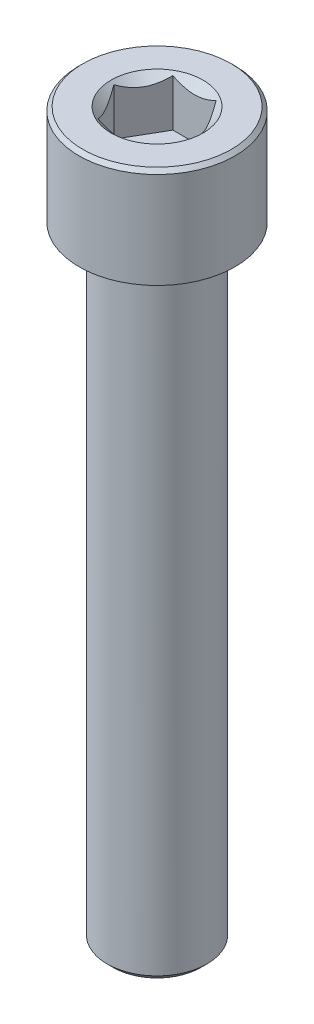
ISO-10303-21;
HEADER;
FILE_DESCRIPTION(('STEP AP214'),'2;1');
FILE_NAME('part.step','',(''),(''),'','','');
FILE_SCHEMA(('AUTOMOTIVE_DESIGN { 1 0 10303 214 1 1 1 1 }'));
ENDSEC;
DATA;
#1=APPLICATION_CONTEXT('core data for automotive mechanical design processes');
#2=APPLICATION_PROTOCOL_DEFINITION('international standard','automotive_design',2000,#1);
#3=PRODUCT_CONTEXT('',#1,'mechanical');
#4=PRODUCT('Part','Part','',(#3));
#5=PRODUCT_RELATED_PRODUCT_CATEGORY('part','',(#4));
#6=PRODUCT_DEFINITION_FORMATION('','',#4);
#7=PRODUCT_DEFINITION_CONTEXT('part definition',#1,'design');
#8=PRODUCT_DEFINITION('design','',#6,#7);
#9=PRODUCT_DEFINITION_SHAPE('','',#8);
#10=(LENGTH_UNIT() NAMED_UNIT(*) SI_UNIT(.MILLI.,.METRE.));
#11=(NAMED_UNIT(*) PLANE_ANGLE_UNIT() SI_UNIT($,.RADIAN.));
#12=(NAMED_UNIT(*) SI_UNIT($,.STERADIAN.) SOLID_ANGLE_UNIT());
#13=UNCERTAINTY_MEASURE_WITH_UNIT(LENGTH_MEASURE(1.E-05),#10,'distance_accuracy_value','');
#14=(GEOMETRIC_REPRESENTATION_CONTEXT(3) GLOBAL_UNCERTAINTY_ASSIGNED_CONTEXT((#13)) GLOBAL_UNIT_ASSIGNED_CONTEXT((#10,
#11,#12)) REPRESENTATION_CONTEXT('',''));
#15=CARTESIAN_POINT('',(0.,0.,0.));
#16=DIRECTION('',(0.,0.,1.));
#17=DIRECTION('',(1.,0.,0.));
#18=AXIS2_PLACEMENT_3D('',#15,#16,#17);
#19=CARTESIAN_POINT('',(0.,0.,0.));
#20=DIRECTION('',(0.,1.,0.));
#21=DIRECTION('',(0.,0.,1.));
#22=AXIS2_PLACEMENT_3D('',#19,#20,#21);
#23=PLANE('',#22);
#24=CARTESIAN_POINT('',(0.,0.,0.));
#25=DIRECTION('',(0.,1.,0.));
#26=DIRECTION('',(0.,0.,1.));
#27=AXIS2_PLACEMENT_3D('',#24,#25,#26);
#28=CIRCLE('',#27,3.5);
#29=CARTESIAN_POINT('',(0.,0.,3.5));
#30=VERTEX_POINT('',#29);
#31=EDGE_CURVE('E43',#30,#30,#28,.F.);
#32=ORIENTED_EDGE('',*,*,#31,.T.);
#33=EDGE_LOOP('',(#32));
#34=FACE_BOUND('',#33,.T.);
#35=ADVANCED_FACE('F35',(#34),#23,.F.);
#36=CARTESIAN_POINT('',(0.,0.,0.));
#37=DIRECTION('',(0.,-1.,0.));
#38=DIRECTION('',(0.,0.,-1.));
#39=AXIS2_PLACEMENT_3D('',#36,#37,#38);
#40=CYLINDRICAL_SURFACE('',#39,4.);
#41=CARTESIAN_POINT('',(0.,0.500000000000004,0.));
#42=DIRECTION('',(0.,1.,0.));
#43=DIRECTION('',(0.,0.,1.));
#44=AXIS2_PLACEMENT_3D('',#41,#42,#43);
#45=CIRCLE('',#44,4.);
#46=CARTESIAN_POINT('',(0.,0.500000000000004,4.));
#47=VERTEX_POINT('',#46);
#48=EDGE_CURVE('E11',#47,#47,#45,.T.);
#49=ORIENTED_EDGE('',*,*,#48,.T.);
#50=EDGE_LOOP('',(#49));
#51=FACE_BOUND('',#50,.T.);
#52=CARTESIAN_POINT('',(0.,50.,0.));
#53=DIRECTION('',(0.,-1.,0.));
#54=DIRECTION('',(0.,0.,-1.));
#55=AXIS2_PLACEMENT_3D('',#52,#53,#54);
#56=CIRCLE('',#55,4.);
#57=CARTESIAN_POINT('',(0.,50.,-4.));
#58=VERTEX_POINT('',#57);
#59=EDGE_CURVE('E120',#58,#58,#56,.T.);
#60=ORIENTED_EDGE('',*,*,#59,.T.);
#61=EDGE_LOOP('',(#60));
#62=FACE_BOUND('',#61,.T.);
#63=ADVANCED_FACE('F191',(#51,#62),#40,.T.);
#64=CARTESIAN_POINT('',(-4.,50.,0.));
#65=DIRECTION('',(0.,1.,0.));
#66=DIRECTION('',(0.,0.,1.));
#67=AXIS2_PLACEMENT_3D('',#64,#65,#66);
#68=PLANE('',#67);
#69=ORIENTED_EDGE('',*,*,#59,.F.);
#70=EDGE_LOOP('',(#69));
#71=FACE_BOUND('',#70,.T.);
#72=CARTESIAN_POINT('',(0.,50.,0.));
#73=DIRECTION('',(0.,-1.,0.));
#74=DIRECTION('',(0.,0.,-1.));
#75=AXIS2_PLACEMENT_3D('',#72,#73,#74);
#76=CIRCLE('',#75,6.25);
#77=CARTESIAN_POINT('',(0.,50.,-6.25));
#78=VERTEX_POINT('',#77);
#79=EDGE_CURVE('E117',#78,#78,#76,.T.);
#80=ORIENTED_EDGE('',*,*,#79,.T.);
#81=EDGE_LOOP('',(#80));
#82=FACE_BOUND('',#81,.T.);
#83=ADVANCED_FACE('F197',(#71,#82),#68,.F.);
#84=CARTESIAN_POINT('',(0.,0.,0.));
#85=DIRECTION('',(0.,-1.,0.));
#86=DIRECTION('',(0.,0.,-1.));
#87=AXIS2_PLACEMENT_3D('',#84,#85,#86);
#88=CYLINDRICAL_SURFACE('',#87,6.25);
#89=CARTESIAN_POINT('',(0.,57.7,0.));
#90=DIRECTION('',(0.,-1.,0.));
#91=DIRECTION('',(0.,0.,-1.));
#92=AXIS2_PLACEMENT_3D('',#89,#90,#91);
#93=CIRCLE('',#92,6.25);
#94=CARTESIAN_POINT('',(0.,57.7,-6.25));
#95=VERTEX_POINT('',#94);
#96=EDGE_CURVE('E123',#95,#95,#93,.T.);
#97=ORIENTED_EDGE('',*,*,#96,.T.);
#98=EDGE_LOOP('',(#97));
#99=FACE_BOUND('',#98,.T.);
#100=ORIENTED_EDGE('',*,*,#79,.F.);
#101=EDGE_LOOP('',(#100));
#102=FACE_BOUND('',#101,.T.);
#103=ADVANCED_FACE('F208',(#99,#102),#88,.T.);
#104=CARTESIAN_POINT('',(-6.25,58.,0.));
#105=DIRECTION('',(0.,-1.,0.));
#106=DIRECTION('',(0.,0.,-1.));
#107=AXIS2_PLACEMENT_3D('',#104,#105,#106);
#108=PLANE('',#107);
#109=CARTESIAN_POINT('',(0.,58.,0.));
#110=DIRECTION('',(0.,1.,0.));
#111=DIRECTION('',(0.,0.,1.));
#112=AXIS2_PLACEMENT_3D('',#109,#110,#111);
#113=CIRCLE('',#112,3.68172134015619);
#114=CARTESIAN_POINT('',(0.,58.,3.68172134015619));
#115=VERTEX_POINT('',#114);
#116=EDGE_CURVE('E338',#115,#115,#113,.T.);
#117=ORIENTED_EDGE('',*,*,#116,.F.);
#118=EDGE_LOOP('',(#117));
#119=FACE_BOUND('',#118,.T.);
#120=CARTESIAN_POINT('',(0.,58.,0.));
#121=DIRECTION('',(0.,-1.,0.));
#122=DIRECTION('',(0.,0.,-1.));
#123=AXIS2_PLACEMENT_3D('',#120,#121,#122);
#124=CIRCLE('',#123,5.94999999999999);
#125=CARTESIAN_POINT('',(0.,58.,-5.94999999999999));
#126=VERTEX_POINT('',#125);
#127=EDGE_CURVE('E94',#126,#126,#124,.F.);
#128=ORIENTED_EDGE('',*,*,#127,.T.);
#129=EDGE_LOOP('',(#128));
#130=FACE_BOUND('',#129,.T.);
#131=ADVANCED_FACE('F203',(#119,#130),#108,.F.);
#132=CARTESIAN_POINT('',(0.,57.7,0.));
#133=DIRECTION('',(0.,-1.,0.));
#134=DIRECTION('',(0.,0.,-1.));
#135=AXIS2_PLACEMENT_3D('',#132,#133,#134);
#136=CONICAL_SURFACE('',#135,6.25,0.78539816339744);
#137=ORIENTED_EDGE('',*,*,#127,.F.);
#138=EDGE_LOOP('',(#137));
#139=FACE_BOUND('',#138,.T.);
#140=ORIENTED_EDGE('',*,*,#96,.F.);
#141=EDGE_LOOP('',(#140));
#142=FACE_BOUND('',#141,.T.);
#143=ADVANCED_FACE('F139',(#139,#142),#136,.T.);
#144=CARTESIAN_POINT('',(0.,58.,0.));
#145=DIRECTION('',(0.,1.,0.));
#146=DIRECTION('',(0.,0.,1.));
#147=AXIS2_PLACEMENT_3D('',#144,#145,#146);
#148=CONICAL_SURFACE('',#147,3.68172134015619,0.785398163397449);
#149=ORIENTED_EDGE('',*,*,#116,.T.);
#150=EDGE_LOOP('',(#149));
#151=FACE_BOUND('',#150,.T.);
#152=CARTESIAN_POINT('',(-3.57414153717217,58.9845928078347,3.));
#153=CARTESIAN_POINT('',(-3.48763354421076,58.918347344031,3.));
#154=CARTESIAN_POINT('',(-3.40065485701271,58.8527068014046,3.));
#155=CARTESIAN_POINT('',(-3.22556536628367,58.7229105596247,3.));
#156=CARTESIAN_POINT('',(-3.13745429592207,58.6587552207989,3.));
#157=CARTESIAN_POINT('',(-2.95926502940819,58.5317477625692,3.));
#158=CARTESIAN_POINT('',(-2.86917689491203,58.4689095404859,3.));
#159=CARTESIAN_POINT('',(-2.68749351951163,58.3454583721269,3.));
#160=CARTESIAN_POINT('',(-2.5958983836401,58.2848452717117,3.));
#161=CARTESIAN_POINT('',(-2.40523426187287,58.1626856152111,3.));
#162=CARTESIAN_POINT('',(-2.30605328102178,58.1013129786067,3.));
#163=CARTESIAN_POINT('',(-2.10536506104801,57.9824325210317,3.));
#164=CARTESIAN_POINT('',(-2.00385743987678,57.9249253409785,3.));
#165=CARTESIAN_POINT('',(-1.79849745550954,57.8150046063731,3.));
#166=CARTESIAN_POINT('',(-1.69465316441121,57.7625760890662,3.));
#167=CARTESIAN_POINT('',(-1.48405420683511,57.663987161909,3.));
#168=CARTESIAN_POINT('',(-1.37730092797841,57.6178238242346,3.));
#169=CARTESIAN_POINT('',(-1.17088222190216,57.5374103113695,3.));
#170=CARTESIAN_POINT('',(-1.07149734601239,57.5024473221765,3.));
#171=CARTESIAN_POINT('',(-0.870230144552075,57.4404802404136,3.));
#172=CARTESIAN_POINT('',(-0.768347657354245,57.4134766643998,3.));
#173=CARTESIAN_POINT('',(-0.56444762477906,57.3693266023403,3.));
#174=CARTESIAN_POINT('',(-0.462468933304163,57.3520036676269,3.));
#175=CARTESIAN_POINT('',(-0.257288650084503,57.3275703633682,3.));
#176=CARTESIAN_POINT('',(-0.154087304614488,57.3204579712627,3.));
#177=CARTESIAN_POINT('',(0.0481861337271408,57.3170323431805,3.));
#178=CARTESIAN_POINT('',(0.147250905244534,57.3202810238262,3.));
#179=CARTESIAN_POINT('',(0.344589076655321,57.3364014246806,3.));
#180=CARTESIAN_POINT('',(0.442862402476964,57.3492740352571,3.));
#181=CARTESIAN_POINT('',(0.639570667541512,57.3841396910622,3.));
#182=CARTESIAN_POINT('',(0.737976852204936,57.4062922789742,3.));
#183=CARTESIAN_POINT('',(0.932628435913932,57.4585009084323,3.));
#184=CARTESIAN_POINT('',(1.02887397223985,57.4885564463,3.));
#185=CARTESIAN_POINT('',(1.22532003458176,57.5574747225556,3.));
#186=CARTESIAN_POINT('',(1.32536043310458,57.5967888675383,3.));
#187=CARTESIAN_POINT('',(1.5228495241282,57.6814775662887,3.));
#188=CARTESIAN_POINT('',(1.62029736425404,57.7268540844093,3.));
#189=CARTESIAN_POINT('',(1.8130860429893,57.8225985437204,3.));
#190=CARTESIAN_POINT('',(1.90841896877327,57.8729822890255,3.));
#191=CARTESIAN_POINT('',(2.09689622819786,57.9776272778976,3.));
#192=CARTESIAN_POINT('',(2.19004094502824,58.031887835746,3.));
#193=CARTESIAN_POINT('',(2.36987261179099,58.1407691556288,3.));
#194=CARTESIAN_POINT('',(2.45665114613525,58.1952394529636,3.));
#195=CARTESIAN_POINT('',(2.62871750489487,58.3064926464856,3.));
#196=CARTESIAN_POINT('',(2.71400521657293,58.3632757164947,3.));
#197=CARTESIAN_POINT('',(2.88259790064295,58.4782780272199,3.));
#198=CARTESIAN_POINT('',(2.96591330750258,58.5364820260229,3.));
#199=CARTESIAN_POINT('',(3.13140205426231,58.6544457904063,3.));
#200=CARTESIAN_POINT('',(3.21357570254096,58.7142051228644,3.));
#201=CARTESIAN_POINT('',(3.29527058173678,58.7746009335197,3.));
#202=B_SPLINE_CURVE_WITH_KNOTS('',3,(#152,#153,#154,#155,#156,#157,#158,#159,#160,#161,#162,
#163,#164,#165,#166,#167,#168,#169,#170,#171,#172,#173,#174,#175,#176,#177,#178,#179,#180,#181,
#182,#183,#184,#185,#186,#187,#188,#189,#190,#191,#192,#193,#194,#195,#196,#197,#198,#199,#200,
#201),.UNSPECIFIED.,.F.,.F.,(4,2,2,2,2,2,2,2,2,2,2,2,2,2,2,2,2,2,2,2,2,2,2,2,4),(0.,
0.32688353469634,0.653845561216812,0.983333574679493,1.31279872045119,1.66263039077581,
2.01251992306798,2.36134508374107,2.71000666706381,3.02579926641578,3.34161235580211,
3.65146388205707,3.96125402275306,4.25812208285704,4.55501761141499,4.85724167639795,
5.15944648441815,5.48166266665301,5.80398350895795,6.12735610013866,6.45067163510514,
6.75800096012909,7.06535342598929,7.37023156667126,7.67502569596997),.UNSPECIFIED.);
#203=CARTESIAN_POINT('',(-1.73205080756888,57.7823802749816,3.));
#204=VERTEX_POINT('',#203);
#205=CARTESIAN_POINT('',(1.73205080756888,57.7823802749816,3.));
#206=VERTEX_POINT('',#205);
#207=EDGE_CURVE('E101',#204,#206,#202,.T.);
#208=ORIENTED_EDGE('',*,*,#207,.F.);
#209=CARTESIAN_POINT('',(-3.46421708519159,57.7824957508087,-0.000199999999999535));
#210=CARTESIAN_POINT('',(-3.40467869607211,57.7230085933033,0.102923514955747));
#211=CARTESIAN_POINT('',(-3.3441447475778,57.6670152544471,0.207771389330649));
#212=CARTESIAN_POINT('',(-3.2207094063533,57.5644928713605,0.421567671781095));
#213=CARTESIAN_POINT('',(-3.15779627521275,57.5180208687229,0.53053641137976));
#214=CARTESIAN_POINT('',(-3.03093496880241,57.4384134634979,0.75026663959703));
#215=CARTESIAN_POINT('',(-2.96701910000606,57.4050779756242,0.860972171762213));
#216=CARTESIAN_POINT('',(-2.83778025907546,57.3537178189609,1.08482041056533));
#217=CARTESIAN_POINT('',(-2.77246123486019,57.3356548125172,1.197956279207));
#218=CARTESIAN_POINT('',(-2.65988677911464,57.3193571834321,1.3929409561927));
#219=CARTESIAN_POINT('',(-2.6127767304643,57.3169446421554,1.47453795400214));
#220=CARTESIAN_POINT('',(-2.51863325954798,57.3210097096387,1.63759922883009));
#221=CARTESIAN_POINT('',(-2.47159986993094,57.3274904350099,1.71906344929899));
#222=CARTESIAN_POINT('',(-2.37797867687426,57.3489719974968,1.88122011233837));
#223=CARTESIAN_POINT('',(-2.33139143122689,57.3639823649488,1.9619115887843));
#224=CARTESIAN_POINT('',(-2.23901705721438,57.4017039210476,2.12190869789134));
#225=CARTESIAN_POINT('',(-2.19322986779049,57.4244145193044,2.2012144363093));
#226=CARTESIAN_POINT('',(-2.11194373930153,57.4711409598355,2.34200614080275));
#227=CARTESIAN_POINT('',(-2.07626488907772,57.4939286026624,2.40380372214602));
#228=CARTESIAN_POINT('',(-2.00554773988155,57.543176561039,2.52628941752022));
#229=CARTESIAN_POINT('',(-1.97050946049034,57.5696369886478,2.5869774976356));
#230=CARTESIAN_POINT('',(-1.90118383838356,57.6256372693729,2.70705299739086));
#231=CARTESIAN_POINT('',(-1.86689452386373,57.6551674394599,2.76644383229592));
#232=CARTESIAN_POINT('',(-1.79895094584795,57.7169193665571,2.88412556146727));
#233=CARTESIAN_POINT('',(-1.76529630793217,57.7491394716409,2.94241710424773));
#234=CARTESIAN_POINT('',(-1.73193533751504,57.7824957508087,3.0002));
#235=B_SPLINE_CURVE_WITH_KNOTS('',3,(#209,#210,#211,#212,#213,#214,#215,#216,#217,#218,#219,
#220,#221,#222,#223,#224,#225,#226,#227,#228,#229,#230,#231,#232,#233,#234),.UNSPECIFIED.,.F.,
.F.,(4,2,2,2,2,2,2,2,2,2,2,2,4),(0.,0.399603557139304,0.801535286397844,1.19708369162343,
1.59163620080173,1.87398941755844,2.15644160919093,2.43921001247425,2.72195674032138,
2.94657516661926,3.17120044767274,3.3951375283781,3.61893808380739),.UNSPECIFIED.);
#236=CARTESIAN_POINT('',(-3.46410161513776,57.7823802749816,0.));
#237=VERTEX_POINT('',#236);
#238=EDGE_CURVE('E159',#237,#204,#235,.T.);
#239=ORIENTED_EDGE('',*,*,#238,.F.);
#240=CARTESIAN_POINT('',(-1.73193533751504,57.7824957508087,-3.0002));
#241=CARTESIAN_POINT('',(-1.79147372663452,57.7230085933033,-2.89707648504425));
#242=CARTESIAN_POINT('',(-1.85200767512883,57.6670152544471,-2.79222861066935));
#243=CARTESIAN_POINT('',(-1.97544301635334,57.5644928713605,-2.57843232821891));
#244=CARTESIAN_POINT('',(-2.03835614749388,57.5180208687229,-2.46946358862024));
#245=CARTESIAN_POINT('',(-2.16521745390422,57.4384134634979,-2.24973336040297));
#246=CARTESIAN_POINT('',(-2.22913332270057,57.4050779756242,-2.13902782823779));
#247=CARTESIAN_POINT('',(-2.35837216363117,57.3537178189609,-1.91517958943468));
#248=CARTESIAN_POINT('',(-2.42369118784643,57.3356548125172,-1.80204372079301));
#249=CARTESIAN_POINT('',(-2.53626564359198,57.3193571834321,-1.60705904380731));
#250=CARTESIAN_POINT('',(-2.58337569224232,57.3169446421554,-1.52546204599788));
#251=CARTESIAN_POINT('',(-2.67751916315865,57.3210097096387,-1.36240077116992));
#252=CARTESIAN_POINT('',(-2.72455255277569,57.3274904350099,-1.28093655070102));
#253=CARTESIAN_POINT('',(-2.81817374583237,57.3489719974968,-1.11877988766164));
#254=CARTESIAN_POINT('',(-2.86476099147973,57.3639823649488,-1.03808841121571));
#255=CARTESIAN_POINT('',(-2.95713536549224,57.4017039210476,-0.878091302108676));
#256=CARTESIAN_POINT('',(-3.00292255491613,57.4244145193044,-0.798785563690715));
#257=CARTESIAN_POINT('',(-3.0842086834051,57.4711409598355,-0.657993859197257));
#258=CARTESIAN_POINT('',(-3.11988753362891,57.4939286026624,-0.596196277853983));
#259=CARTESIAN_POINT('',(-3.19060468282508,57.543176561039,-0.473710582479787));
#260=CARTESIAN_POINT('',(-3.22564296221629,57.5696369886478,-0.413022502364403));
#261=CARTESIAN_POINT('',(-3.29496858432307,57.6256372693729,-0.292947002609142));
#262=CARTESIAN_POINT('',(-3.3292578988429,57.6551674394599,-0.233556167704086));
#263=CARTESIAN_POINT('',(-3.39720147685868,57.7169193665571,-0.115874438532734));
#264=CARTESIAN_POINT('',(-3.43085611477447,57.7491394716409,-0.0575828957522682));
#265=CARTESIAN_POINT('',(-3.46421708519159,57.7824957508087,0.000199999999998118));
#266=B_SPLINE_CURVE_WITH_KNOTS('',3,(#240,#241,#242,#243,#244,#245,#246,#247,#248,#249,#250,
#251,#252,#253,#254,#255,#256,#257,#258,#259,#260,#261,#262,#263,#264,#265),.UNSPECIFIED.,.F.,
.F.,(4,2,2,2,2,2,2,2,2,2,2,2,4),(0.,0.399603557139303,0.801535286397839,1.19708369162342,
1.59163620080172,1.87398941755843,2.15644160919091,2.43921001247423,2.72195674032137,
2.94657516661926,3.17120044767273,3.39513752837809,3.61893808380739),.UNSPECIFIED.);
#267=CARTESIAN_POINT('',(-1.73205080756888,57.7823802749816,-3.));
#268=VERTEX_POINT('',#267);
#269=EDGE_CURVE('E153',#268,#237,#266,.T.);
#270=ORIENTED_EDGE('',*,*,#269,.F.);
#271=CARTESIAN_POINT('',(-3.57414153716177,58.9845928078267,-3.));
#272=CARTESIAN_POINT('',(-3.48763354420067,58.9183473440233,-3.));
#273=CARTESIAN_POINT('',(-3.40065485700291,58.8527068013973,-3.));
#274=CARTESIAN_POINT('',(-3.22556536627448,58.722910559618,-3.));
#275=CARTESIAN_POINT('',(-3.13745429591318,58.6587552207925,-3.));
#276=CARTESIAN_POINT('',(-2.95926502939991,58.5317477625634,-3.));
#277=CARTESIAN_POINT('',(-2.86917689490407,58.4689095404804,-3.));
#278=CARTESIAN_POINT('',(-2.6874935195043,58.3454583721221,-3.));
#279=CARTESIAN_POINT('',(-2.59589838363308,58.2848452717071,-3.));
#280=CARTESIAN_POINT('',(-2.40523426186654,58.1626856152071,-3.));
#281=CARTESIAN_POINT('',(-2.30605328101581,58.1013129786031,-3.));
#282=CARTESIAN_POINT('',(-2.1053650610428,57.9824325210287,-3.));
#283=CARTESIAN_POINT('',(-2.00385743987194,57.9249253409758,-3.));
#284=CARTESIAN_POINT('',(-1.79849745550548,57.815004606371,-3.));
#285=CARTESIAN_POINT('',(-1.69465316440755,57.7625760890644,-3.));
#286=CARTESIAN_POINT('',(-1.48405420683226,57.6639871619078,-3.));
#287=CARTESIAN_POINT('',(-1.37730092797598,57.6178238242335,-3.));
#288=CARTESIAN_POINT('',(-1.1708822218999,57.5374103113687,-3.));
#289=CARTESIAN_POINT('',(-1.07149734600987,57.5024473221756,-3.));
#290=CARTESIAN_POINT('',(-0.870230144549027,57.4404802404128,-3.));
#291=CARTESIAN_POINT('',(-0.768347657350928,57.413476664399,-3.));
#292=CARTESIAN_POINT('',(-0.564447624775212,57.3693266023395,-3.));
#293=CARTESIAN_POINT('',(-0.462468933300054,57.3520036676262,-3.));
#294=CARTESIAN_POINT('',(-0.257288650079879,57.3275703633678,-3.));
#295=CARTESIAN_POINT('',(-0.154087304609609,57.3204579712624,-3.));
#296=CARTESIAN_POINT('',(0.0481861337324604,57.3170323431805,-3.));
#297=CARTESIAN_POINT('',(0.147250905250042,57.3202810238264,-3.));
#298=CARTESIAN_POINT('',(0.344589076661184,57.3364014246813,-3.));
#299=CARTESIAN_POINT('',(0.442862402482995,57.349274035258,-3.));
#300=CARTESIAN_POINT('',(0.639570667547874,57.3841396910636,-3.));
#301=CARTESIAN_POINT('',(0.737976852211461,57.4062922789758,-3.));
#302=CARTESIAN_POINT('',(0.932628435920765,57.4585009084343,-3.));
#303=CARTESIAN_POINT('',(1.02887397224682,57.4885564463023,-3.));
#304=CARTESIAN_POINT('',(1.22532003458955,57.5574747225585,-3.));
#305=CARTESIAN_POINT('',(1.32536043311303,57.5967888675417,-3.));
#306=CARTESIAN_POINT('',(1.52284952413793,57.6814775662931,-3.));
#307=CARTESIAN_POINT('',(1.62029736426439,57.7268540844142,-3.));
#308=CARTESIAN_POINT('',(1.81308604300087,57.8225985437264,-3.));
#309=CARTESIAN_POINT('',(1.90841896878543,57.8729822890321,-3.));
#310=CARTESIAN_POINT('',(2.09689622821121,57.9776272779052,-3.));
#311=CARTESIAN_POINT('',(2.19004094504217,58.0318878357542,-3.));
#312=CARTESIAN_POINT('',(2.36987261180597,58.1407691556381,-3.));
#313=CARTESIAN_POINT('',(2.45665114615071,58.1952394529734,-3.));
#314=CARTESIAN_POINT('',(2.62871750491127,58.3064926464964,-3.));
#315=CARTESIAN_POINT('',(2.71400521658979,58.363275716506,-3.));
#316=CARTESIAN_POINT('',(2.88259790066074,58.4782780272322,-3.));
#317=CARTESIAN_POINT('',(2.96591330752083,58.5364820260357,-3.));
#318=CARTESIAN_POINT('',(3.13140205428148,58.6544457904201,-3.));
#319=CARTESIAN_POINT('',(3.21357570256058,58.7142051228787,-3.));
#320=CARTESIAN_POINT('',(3.29527058175686,58.7746009335346,-3.));
#321=B_SPLINE_CURVE_WITH_KNOTS('',3,(#271,#272,#273,#274,#275,#276,#277,#278,#279,#280,#281,
#282,#283,#284,#285,#286,#287,#288,#289,#290,#291,#292,#293,#294,#295,#296,#297,#298,#299,#300,
#301,#302,#303,#304,#305,#306,#307,#308,#309,#310,#311,#312,#313,#314,#315,#316,#317,#318,#319,
#320),.UNSPECIFIED.,.F.,.F.,(4,2,2,2,2,2,2,2,2,2,2,2,2,2,2,2,2,2,2,2,2,2,2,2,4),(0.,
0.326883534695066,0.653845561214268,0.983333574675645,1.31279872044605,1.66263039076922,
2.01251992305993,2.36134508373157,2.71000666705287,3.0257992664056,3.34161235579269,
3.65146388204838,3.96125402274509,4.25812208284965,4.55501761140818,4.85724167639177,
5.1594464844126,5.4816626666498,5.80398350895709,6.12735610014016,6.450671635109,
6.75800096013495,7.06535342599717,7.37023156668114,7.67502569598184),.UNSPECIFIED.);
#322=CARTESIAN_POINT('',(1.73205080756888,57.7823802749816,-3.));
#323=VERTEX_POINT('',#322);
#324=EDGE_CURVE('E50',#323,#268,#321,.F.);
#325=ORIENTED_EDGE('',*,*,#324,.F.);
#326=CARTESIAN_POINT('',(3.46421708519159,57.7824957508087,0.000199999999998427));
#327=CARTESIAN_POINT('',(3.40467869607211,57.7230085933033,-0.102923514955748));
#328=CARTESIAN_POINT('',(3.3441447475778,57.6670152544471,-0.20777138933065));
#329=CARTESIAN_POINT('',(3.2207094063533,57.5644928713605,-0.421567671781096));
#330=CARTESIAN_POINT('',(3.15779627521275,57.5180208687229,-0.53053641137976));
#331=CARTESIAN_POINT('',(3.03093496880241,57.4384134634979,-0.750266639597028));
#332=CARTESIAN_POINT('',(2.96701910000607,57.4050779756242,-0.86097217176221));
#333=CARTESIAN_POINT('',(2.83778025907547,57.3537178189609,-1.08482041056532));
#334=CARTESIAN_POINT('',(2.7724612348602,57.3356548125172,-1.19795627920699));
#335=CARTESIAN_POINT('',(2.65988677911465,57.3193571834321,-1.3929409561927));
#336=CARTESIAN_POINT('',(2.6127767304643,57.3169446421554,-1.47453795400213));
#337=CARTESIAN_POINT('',(2.51863325954798,57.3210097096387,-1.63759922883009));
#338=CARTESIAN_POINT('',(2.47159986993094,57.3274904350099,-1.71906344929898));
#339=CARTESIAN_POINT('',(2.37797867687426,57.3489719974968,-1.88122011233837));
#340=CARTESIAN_POINT('',(2.33139143122689,57.3639823649488,-1.9619115887843));
#341=CARTESIAN_POINT('',(2.23901705721439,57.4017039210476,-2.12190869789133));
#342=CARTESIAN_POINT('',(2.1932298677905,57.4244145193044,-2.20121443630929));
#343=CARTESIAN_POINT('',(2.11194373930153,57.4711409598355,-2.34200614080275));
#344=CARTESIAN_POINT('',(2.07626488907772,57.4939286026624,-2.40380372214602));
#345=CARTESIAN_POINT('',(2.00554773988155,57.543176561039,-2.52628941752021));
#346=CARTESIAN_POINT('',(1.97050946049034,57.5696369886478,-2.5869774976356));
#347=CARTESIAN_POINT('',(1.90118383838356,57.6256372693729,-2.70705299739086));
#348=CARTESIAN_POINT('',(1.86689452386373,57.6551674394599,-2.76644383229592));
#349=CARTESIAN_POINT('',(1.79895094584795,57.7169193665571,-2.88412556146727));
#350=CARTESIAN_POINT('',(1.76529630793217,57.7491394716409,-2.94241710424773));
#351=CARTESIAN_POINT('',(1.73193533751504,57.7824957508087,-3.0002));
#352=B_SPLINE_CURVE_WITH_KNOTS('',3,(#326,#327,#328,#329,#330,#331,#332,#333,#334,#335,#336,
#337,#338,#339,#340,#341,#342,#343,#344,#345,#346,#347,#348,#349,#350,#351),.UNSPECIFIED.,.F.,
.F.,(4,2,2,2,2,2,2,2,2,2,2,2,4),(0.,0.399603557139304,0.801535286397842,1.19708369162343,
1.59163620080172,1.87398941755844,2.15644160919092,2.43921001247424,2.72195674032137,
2.94657516661926,3.17120044767274,3.3951375283781,3.61893808380739),.UNSPECIFIED.);
#353=CARTESIAN_POINT('',(3.46410161513776,57.7823802749816,0.));
#354=VERTEX_POINT('',#353);
#355=EDGE_CURVE('E87',#354,#323,#352,.T.);
#356=ORIENTED_EDGE('',*,*,#355,.F.);
#357=CARTESIAN_POINT('',(1.73193533751504,57.7824957508087,3.0002));
#358=CARTESIAN_POINT('',(1.79147372663452,57.7230085933033,2.89707648504425));
#359=CARTESIAN_POINT('',(1.85200767512883,57.6670152544471,2.79222861066935));
#360=CARTESIAN_POINT('',(1.97544301635334,57.5644928713605,2.57843232821891));
#361=CARTESIAN_POINT('',(2.03835614749388,57.5180208687229,2.46946358862024));
#362=CARTESIAN_POINT('',(2.16521745390422,57.4384134634979,2.24973336040297));
#363=CARTESIAN_POINT('',(2.22913332270057,57.4050779756242,2.13902782823779));
#364=CARTESIAN_POINT('',(2.35837216363117,57.3537178189609,1.91517958943468));
#365=CARTESIAN_POINT('',(2.42369118784644,57.3356548125172,1.80204372079301));
#366=CARTESIAN_POINT('',(2.53626564359199,57.3193571834321,1.6070590438073));
#367=CARTESIAN_POINT('',(2.58337569224233,57.3169446421554,1.52546204599787));
#368=CARTESIAN_POINT('',(2.67751916315865,57.3210097096387,1.36240077116991));
#369=CARTESIAN_POINT('',(2.72455255277569,57.3274904350099,1.28093655070102));
#370=CARTESIAN_POINT('',(2.81817374583237,57.3489719974968,1.11877988766163));
#371=CARTESIAN_POINT('',(2.86476099147974,57.3639823649488,1.0380884112157));
#372=CARTESIAN_POINT('',(2.95713536549224,57.4017039210476,0.87809130210867));
#373=CARTESIAN_POINT('',(3.00292255491614,57.4244145193044,0.798785563690709));
#374=CARTESIAN_POINT('',(3.0842086834051,57.4711409598355,0.657993859197251));
#375=CARTESIAN_POINT('',(3.11988753362891,57.4939286026624,0.596196277853978));
#376=CARTESIAN_POINT('',(3.19060468282508,57.543176561039,0.473710582479783));
#377=CARTESIAN_POINT('',(3.2256429622163,57.5696369886478,0.413022502364399));
#378=CARTESIAN_POINT('',(3.29496858432307,57.6256372693729,0.292947002609139));
#379=CARTESIAN_POINT('',(3.3292578988429,57.6551674394599,0.233556167704084));
#380=CARTESIAN_POINT('',(3.39720147685868,57.7169193665571,0.115874438532732));
#381=CARTESIAN_POINT('',(3.43085611477446,57.7491394716409,0.0575828957522659));
#382=CARTESIAN_POINT('',(3.46421708519159,57.7824957508087,-0.000200000000000726));
#383=B_SPLINE_CURVE_WITH_KNOTS('',3,(#357,#358,#359,#360,#361,#362,#363,#364,#365,#366,#367,
#368,#369,#370,#371,#372,#373,#374,#375,#376,#377,#378,#379,#380,#381,#382),.UNSPECIFIED.,.F.,
.F.,(4,2,2,2,2,2,2,2,2,2,2,2,4),(0.,0.399603557139305,0.801535286397843,1.19708369162343,
1.59163620080173,1.87398941755844,2.15644160919092,2.43921001247424,2.72195674032137,
2.94657516661926,3.17120044767274,3.3951375283781,3.61893808380739),.UNSPECIFIED.);
#384=EDGE_CURVE('E90',#206,#354,#383,.T.);
#385=ORIENTED_EDGE('',*,*,#384,.F.);
#386=EDGE_LOOP('',(#208,#239,#270,#325,#356,#385));
#387=FACE_BOUND('',#386,.T.);
#388=ADVANCED_FACE('F89',(#151,#387),#148,.F.);
#389=CARTESIAN_POINT('',(3.46410161513775,54.,0.));
#390=DIRECTION('',(0.,1.,0.));
#391=DIRECTION('',(0.,0.,1.));
#392=AXIS2_PLACEMENT_3D('',#389,#390,#391);
#393=PLANE('',#392);
#394=DIRECTION('',(0.5,0.,-0.866025403784439));
#395=VECTOR('',#394,1.);
#396=CARTESIAN_POINT('',(1.73205080756888,54.,3.));
#397=LINE('',#396,#395);
#398=CARTESIAN_POINT('',(1.73205080756888,54.,3.));
#399=VERTEX_POINT('',#398);
#400=CARTESIAN_POINT('',(3.46410161513775,54.,0.));
#401=VERTEX_POINT('',#400);
#402=EDGE_CURVE('E100',#399,#401,#397,.T.);
#403=ORIENTED_EDGE('',*,*,#402,.T.);
#404=DIRECTION('',(-0.5,0.,-0.866025403784438));
#405=VECTOR('',#404,1.);
#406=CARTESIAN_POINT('',(3.46410161513775,54.,0.));
#407=LINE('',#406,#405);
#408=CARTESIAN_POINT('',(1.73205080756888,54.,-3.));
#409=VERTEX_POINT('',#408);
#410=EDGE_CURVE('E105',#401,#409,#407,.T.);
#411=ORIENTED_EDGE('',*,*,#410,.T.);
#412=DIRECTION('',(-1.,0.,0.));
#413=VECTOR('',#412,1.);
#414=CARTESIAN_POINT('',(1.73205080756888,54.,-3.));
#415=LINE('',#414,#413);
#416=CARTESIAN_POINT('',(-1.73205080756888,54.,-3.));
#417=VERTEX_POINT('',#416);
#418=EDGE_CURVE('E320',#409,#417,#415,.T.);
#419=ORIENTED_EDGE('',*,*,#418,.T.);
#420=DIRECTION('',(-0.5,0.,0.866025403784439));
#421=VECTOR('',#420,1.);
#422=CARTESIAN_POINT('',(-1.73205080756888,54.,-3.));
#423=LINE('',#422,#421);
#424=CARTESIAN_POINT('',(-3.46410161513776,54.,0.));
#425=VERTEX_POINT('',#424);
#426=EDGE_CURVE('E324',#417,#425,#423,.T.);
#427=ORIENTED_EDGE('',*,*,#426,.T.);
#428=DIRECTION('',(0.5,0.,0.866025403784439));
#429=VECTOR('',#428,1.);
#430=CARTESIAN_POINT('',(-3.46410161513776,54.,0.));
#431=LINE('',#430,#429);
#432=CARTESIAN_POINT('',(-1.73205080756888,54.,3.));
#433=VERTEX_POINT('',#432);
#434=EDGE_CURVE('E113',#425,#433,#431,.T.);
#435=ORIENTED_EDGE('',*,*,#434,.T.);
#436=DIRECTION('',(1.,0.,0.));
#437=VECTOR('',#436,1.);
#438=CARTESIAN_POINT('',(-1.73205080756888,54.,3.));
#439=LINE('',#438,#437);
#440=EDGE_CURVE('E108',#433,#399,#439,.T.);
#441=ORIENTED_EDGE('',*,*,#440,.T.);
#442=EDGE_LOOP('',(#403,#411,#419,#427,#435,#441));
#443=FACE_BOUND('',#442,.T.);
#444=ADVANCED_FACE('F138',(#443),#393,.T.);
#445=CARTESIAN_POINT('',(3.46410161513775,54.,0.));
#446=DIRECTION('',(0.866025403784439,0.,-0.5));
#447=DIRECTION('',(-0.5,0.,-0.866025403784438));
#448=AXIS2_PLACEMENT_3D('',#445,#446,#447);
#449=PLANE('',#448);
#450=DIRECTION('',(0.,1.,0.));
#451=VECTOR('',#450,1.);
#452=CARTESIAN_POINT('',(3.46410161513775,54.,0.));
#453=LINE('',#452,#451);
#454=EDGE_CURVE('E98',#401,#354,#453,.T.);
#455=ORIENTED_EDGE('',*,*,#454,.T.);
#456=ORIENTED_EDGE('',*,*,#355,.T.);
#457=DIRECTION('',(0.,1.,0.));
#458=VECTOR('',#457,1.);
#459=CARTESIAN_POINT('',(1.73205080756888,54.,-3.));
#460=LINE('',#459,#458);
#461=EDGE_CURVE('E107',#409,#323,#460,.T.);
#462=ORIENTED_EDGE('',*,*,#461,.F.);
#463=ORIENTED_EDGE('',*,*,#410,.F.);
#464=EDGE_LOOP('',(#455,#456,#462,#463));
#465=FACE_BOUND('',#464,.T.);
#466=ADVANCED_FACE('F103',(#465),#449,.F.);
#467=CARTESIAN_POINT('',(1.73205080756888,54.,-3.));
#468=DIRECTION('',(0.,0.,-1.));
#469=DIRECTION('',(-1.,0.,0.));
#470=AXIS2_PLACEMENT_3D('',#467,#468,#469);
#471=PLANE('',#470);
#472=ORIENTED_EDGE('',*,*,#461,.T.);
#473=ORIENTED_EDGE('',*,*,#324,.T.);
#474=DIRECTION('',(0.,1.,0.));
#475=VECTOR('',#474,1.);
#476=CARTESIAN_POINT('',(-1.73205080756888,54.,-3.));
#477=LINE('',#476,#475);
#478=EDGE_CURVE('E110',#417,#268,#477,.T.);
#479=ORIENTED_EDGE('',*,*,#478,.F.);
#480=ORIENTED_EDGE('',*,*,#418,.F.);
#481=EDGE_LOOP('',(#472,#473,#479,#480));
#482=FACE_BOUND('',#481,.T.);
#483=ADVANCED_FACE('F182',(#482),#471,.F.);
#484=CARTESIAN_POINT('',(-1.73205080756888,54.,-3.));
#485=DIRECTION('',(-0.866025403784439,0.,-0.5));
#486=DIRECTION('',(-0.5,0.,0.866025403784439));
#487=AXIS2_PLACEMENT_3D('',#484,#485,#486);
#488=PLANE('',#487);
#489=ORIENTED_EDGE('',*,*,#478,.T.);
#490=ORIENTED_EDGE('',*,*,#269,.T.);
#491=DIRECTION('',(0.,1.,0.));
#492=VECTOR('',#491,1.);
#493=CARTESIAN_POINT('',(-3.46410161513776,54.,0.));
#494=LINE('',#493,#492);
#495=EDGE_CURVE('E332',#425,#237,#494,.T.);
#496=ORIENTED_EDGE('',*,*,#495,.F.);
#497=ORIENTED_EDGE('',*,*,#426,.F.);
#498=EDGE_LOOP('',(#489,#490,#496,#497));
#499=FACE_BOUND('',#498,.T.);
#500=ADVANCED_FACE('F178',(#499),#488,.F.);
#501=CARTESIAN_POINT('',(-3.46410161513776,54.,0.));
#502=DIRECTION('',(-0.866025403784439,0.,0.5));
#503=DIRECTION('',(0.5,0.,0.866025403784439));
#504=AXIS2_PLACEMENT_3D('',#501,#502,#503);
#505=PLANE('',#504);
#506=ORIENTED_EDGE('',*,*,#495,.T.);
#507=ORIENTED_EDGE('',*,*,#238,.T.);
#508=DIRECTION('',(0.,1.,0.));
#509=VECTOR('',#508,1.);
#510=CARTESIAN_POINT('',(-1.73205080756888,54.,3.));
#511=LINE('',#510,#509);
#512=EDGE_CURVE('E329',#433,#204,#511,.T.);
#513=ORIENTED_EDGE('',*,*,#512,.F.);
#514=ORIENTED_EDGE('',*,*,#434,.F.);
#515=EDGE_LOOP('',(#506,#507,#513,#514));
#516=FACE_BOUND('',#515,.T.);
#517=ADVANCED_FACE('F175',(#516),#505,.F.);
#518=CARTESIAN_POINT('',(-1.73205080756888,54.,3.));
#519=DIRECTION('',(0.,0.,1.));
#520=DIRECTION('',(1.,0.,0.));
#521=AXIS2_PLACEMENT_3D('',#518,#519,#520);
#522=PLANE('',#521);
#523=ORIENTED_EDGE('',*,*,#512,.T.);
#524=ORIENTED_EDGE('',*,*,#207,.T.);
#525=DIRECTION('',(0.,1.,0.));
#526=VECTOR('',#525,1.);
#527=CARTESIAN_POINT('',(1.73205080756888,54.,3.));
#528=LINE('',#527,#526);
#529=EDGE_CURVE('E58',#399,#206,#528,.T.);
#530=ORIENTED_EDGE('',*,*,#529,.F.);
#531=ORIENTED_EDGE('',*,*,#440,.F.);
#532=EDGE_LOOP('',(#523,#524,#530,#531));
#533=FACE_BOUND('',#532,.T.);
#534=ADVANCED_FACE('F172',(#533),#522,.F.);
#535=CARTESIAN_POINT('',(1.73205080756888,54.,3.));
#536=DIRECTION('',(0.866025403784439,0.,0.5));
#537=DIRECTION('',(0.5,0.,-0.866025403784439));
#538=AXIS2_PLACEMENT_3D('',#535,#536,#537);
#539=PLANE('',#538);
#540=ORIENTED_EDGE('',*,*,#529,.T.);
#541=ORIENTED_EDGE('',*,*,#384,.T.);
#542=ORIENTED_EDGE('',*,*,#454,.F.);
#543=ORIENTED_EDGE('',*,*,#402,.F.);
#544=EDGE_LOOP('',(#540,#541,#542,#543));
#545=FACE_BOUND('',#544,.T.);
#546=ADVANCED_FACE('F97',(#545),#539,.F.);
#547=CARTESIAN_POINT('',(0.,0.,0.));
#548=DIRECTION('',(0.,1.,0.));
#549=DIRECTION('',(0.,0.,1.));
#550=AXIS2_PLACEMENT_3D('',#547,#548,#549);
#551=CONICAL_SURFACE('',#550,3.5,0.785398163397448);
#552=ORIENTED_EDGE('',*,*,#48,.F.);
#553=EDGE_LOOP('',(#552));
#554=FACE_BOUND('',#553,.T.);
#555=ORIENTED_EDGE('',*,*,#31,.F.);
#556=EDGE_LOOP('',(#555));
#557=FACE_BOUND('',#556,.T.);
#558=ADVANCED_FACE('F37',(#554,#557),#551,.T.);
#559=CLOSED_SHELL('',(#35,#63,#83,#103,#131,#143,#388,#444,#466,#483,#500,#517,#534,#546,#558));
#560=MANIFOLD_SOLID_BREP('B2',#559);
#561=ADVANCED_BREP_SHAPE_REPRESENTATION('',(#18,#560),#14);
#562=SHAPE_DEFINITION_REPRESENTATION(#9,#561);
ENDSEC;
END-ISO-10303-21;
